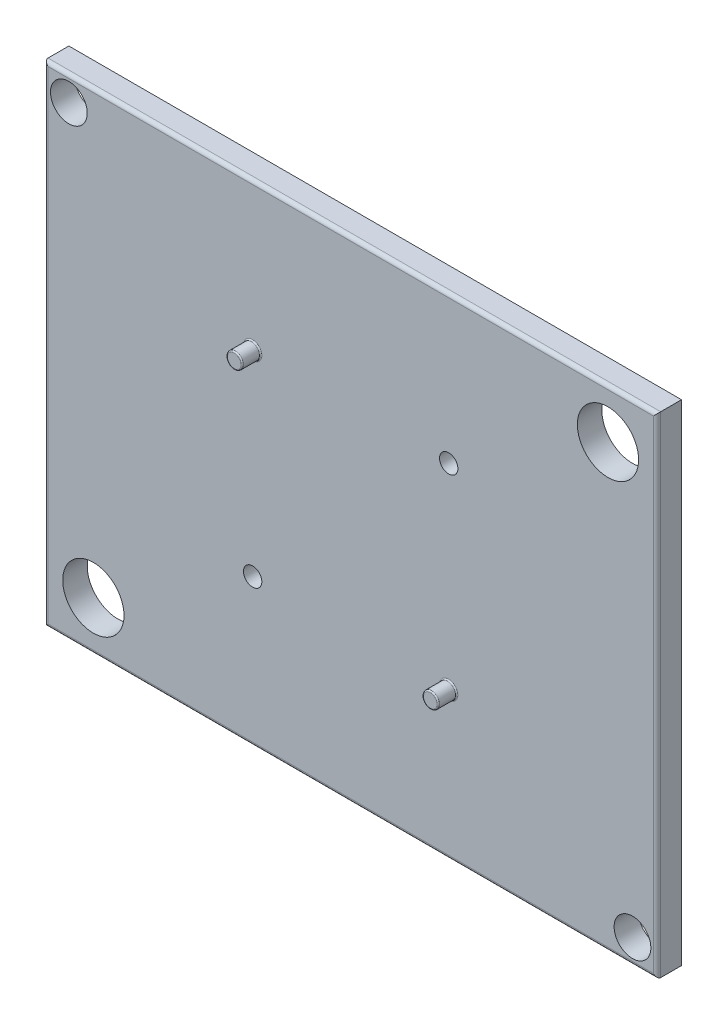
ISO-10303-21;
HEADER;
FILE_DESCRIPTION(('STEP AP214'),'2;1');
FILE_NAME('part.step','',(''),(''),'','','');
FILE_SCHEMA(('AUTOMOTIVE_DESIGN { 1 0 10303 214 1 1 1 1 }'));
ENDSEC;
DATA;
#1=APPLICATION_CONTEXT('core data for automotive mechanical design processes');
#2=APPLICATION_PROTOCOL_DEFINITION('international standard','automotive_design',2000,#1);
#3=PRODUCT_CONTEXT('',#1,'mechanical');
#4=PRODUCT('Part','Part','',(#3));
#5=PRODUCT_RELATED_PRODUCT_CATEGORY('part','',(#4));
#6=PRODUCT_DEFINITION_FORMATION('','',#4);
#7=PRODUCT_DEFINITION_CONTEXT('part definition',#1,'design');
#8=PRODUCT_DEFINITION('design','',#6,#7);
#9=PRODUCT_DEFINITION_SHAPE('','',#8);
#10=(LENGTH_UNIT() NAMED_UNIT(*) SI_UNIT(.MILLI.,.METRE.));
#11=(NAMED_UNIT(*) PLANE_ANGLE_UNIT() SI_UNIT($,.RADIAN.));
#12=(NAMED_UNIT(*) SI_UNIT($,.STERADIAN.) SOLID_ANGLE_UNIT());
#13=UNCERTAINTY_MEASURE_WITH_UNIT(LENGTH_MEASURE(1.E-05),#10,'distance_accuracy_value','');
#14=(GEOMETRIC_REPRESENTATION_CONTEXT(3) GLOBAL_UNCERTAINTY_ASSIGNED_CONTEXT((#13)) GLOBAL_UNIT_ASSIGNED_CONTEXT((#10,
#11,#12)) REPRESENTATION_CONTEXT('',''));
#15=CARTESIAN_POINT('',(0.,0.,0.));
#16=DIRECTION('',(0.,0.,1.));
#17=DIRECTION('',(1.,0.,0.));
#18=AXIS2_PLACEMENT_3D('',#15,#16,#17);
#19=CARTESIAN_POINT('',(0.,0.,2.));
#20=DIRECTION('',(0.,0.,1.));
#21=DIRECTION('',(1.,0.,0.));
#22=AXIS2_PLACEMENT_3D('',#19,#20,#21);
#23=PLANE('',#22);
#24=CARTESIAN_POINT('',(-8.,8.,2.));
#25=DIRECTION('',(0.,0.,1.));
#26=DIRECTION('',(1.,0.,0.));
#27=AXIS2_PLACEMENT_3D('',#24,#25,#26);
#28=CIRCLE('',#27,0.749999999999999);
#29=CARTESIAN_POINT('',(-7.25,8.,2.));
#30=VERTEX_POINT('',#29);
#31=EDGE_CURVE('E156',#30,#30,#28,.F.);
#32=ORIENTED_EDGE('',*,*,#31,.T.);
#33=EDGE_LOOP('',(#32));
#34=FACE_BOUND('',#33,.T.);
#35=CARTESIAN_POINT('',(8.,-8.,2.));
#36=DIRECTION('',(0.,0.,1.));
#37=DIRECTION('',(1.,0.,0.));
#38=AXIS2_PLACEMENT_3D('',#35,#36,#37);
#39=CIRCLE('',#38,0.749999999999999);
#40=CARTESIAN_POINT('',(8.75,-8.,2.));
#41=VERTEX_POINT('',#40);
#42=EDGE_CURVE('E142',#41,#41,#39,.F.);
#43=ORIENTED_EDGE('',*,*,#42,.T.);
#44=EDGE_LOOP('',(#43));
#45=FACE_BOUND('',#44,.T.);
#46=DIRECTION('',(0.,-1.,0.));
#47=VECTOR('',#46,1.);
#48=CARTESIAN_POINT('',(-24.7,-20.,2.));
#49=LINE('',#48,#47);
#50=CARTESIAN_POINT('',(-24.7,19.7,2.));
#51=VERTEX_POINT('',#50);
#52=CARTESIAN_POINT('',(-24.7,-19.7,2.));
#53=VERTEX_POINT('',#52);
#54=EDGE_CURVE('E97',#51,#53,#49,.T.);
#55=ORIENTED_EDGE('',*,*,#54,.T.);
#56=DIRECTION('',(1.,0.,0.));
#57=VECTOR('',#56,1.);
#58=CARTESIAN_POINT('',(25.,-19.7,2.));
#59=LINE('',#58,#57);
#60=CARTESIAN_POINT('',(24.7,-19.7,2.));
#61=VERTEX_POINT('',#60);
#62=EDGE_CURVE('E132',#53,#61,#59,.T.);
#63=ORIENTED_EDGE('',*,*,#62,.T.);
#64=DIRECTION('',(0.,1.,0.));
#65=VECTOR('',#64,1.);
#66=CARTESIAN_POINT('',(24.7,20.,2.));
#67=LINE('',#66,#65);
#68=CARTESIAN_POINT('',(24.7,19.7,2.));
#69=VERTEX_POINT('',#68);
#70=EDGE_CURVE('E130',#61,#69,#67,.T.);
#71=ORIENTED_EDGE('',*,*,#70,.T.);
#72=DIRECTION('',(-1.,0.,0.));
#73=VECTOR('',#72,1.);
#74=CARTESIAN_POINT('',(-25.,19.7,2.));
#75=LINE('',#74,#73);
#76=EDGE_CURVE('E128',#69,#51,#75,.T.);
#77=ORIENTED_EDGE('',*,*,#76,.T.);
#78=EDGE_LOOP('',(#55,#63,#71,#77));
#79=FACE_BOUND('',#78,.T.);
#80=CARTESIAN_POINT('',(-21.,-16.,2.));
#81=DIRECTION('',(0.,0.,1.));
#82=DIRECTION('',(1.,0.,0.));
#83=AXIS2_PLACEMENT_3D('',#80,#81,#82);
#84=CIRCLE('',#83,2.5);
#85=CARTESIAN_POINT('',(-18.5,-16.,2.));
#86=VERTEX_POINT('',#85);
#87=EDGE_CURVE('E192',#86,#86,#84,.T.);
#88=ORIENTED_EDGE('',*,*,#87,.F.);
#89=EDGE_LOOP('',(#88));
#90=FACE_BOUND('',#89,.T.);
#91=CARTESIAN_POINT('',(8.,8.,2.));
#92=DIRECTION('',(0.,0.,1.));
#93=DIRECTION('',(1.,0.,0.));
#94=AXIS2_PLACEMENT_3D('',#91,#92,#93);
#95=CIRCLE('',#94,0.75);
#96=CARTESIAN_POINT('',(8.75,8.,2.));
#97=VERTEX_POINT('',#96);
#98=EDGE_CURVE('E196',#97,#97,#95,.T.);
#99=ORIENTED_EDGE('',*,*,#98,.F.);
#100=EDGE_LOOP('',(#99));
#101=FACE_BOUND('',#100,.T.);
#102=CARTESIAN_POINT('',(-23.,18.,2.));
#103=DIRECTION('',(0.,0.,1.));
#104=DIRECTION('',(1.,0.,0.));
#105=AXIS2_PLACEMENT_3D('',#102,#103,#104);
#106=CIRCLE('',#105,1.5);
#107=CARTESIAN_POINT('',(-21.5,18.,2.));
#108=VERTEX_POINT('',#107);
#109=EDGE_CURVE('E113',#108,#108,#106,.T.);
#110=ORIENTED_EDGE('',*,*,#109,.F.);
#111=EDGE_LOOP('',(#110));
#112=FACE_BOUND('',#111,.T.);
#113=CARTESIAN_POINT('',(23.,-18.,2.));
#114=DIRECTION('',(0.,0.,1.));
#115=DIRECTION('',(1.,0.,0.));
#116=AXIS2_PLACEMENT_3D('',#113,#114,#115);
#117=CIRCLE('',#116,1.5);
#118=CARTESIAN_POINT('',(24.5,-18.,2.));
#119=VERTEX_POINT('',#118);
#120=EDGE_CURVE('E202',#119,#119,#117,.T.);
#121=ORIENTED_EDGE('',*,*,#120,.F.);
#122=EDGE_LOOP('',(#121));
#123=FACE_BOUND('',#122,.T.);
#124=CARTESIAN_POINT('',(-8.,-8.,2.));
#125=DIRECTION('',(0.,0.,1.));
#126=DIRECTION('',(1.,0.,0.));
#127=AXIS2_PLACEMENT_3D('',#124,#125,#126);
#128=CIRCLE('',#127,0.75);
#129=CARTESIAN_POINT('',(-7.25,-8.,2.));
#130=VERTEX_POINT('',#129);
#131=EDGE_CURVE('E206',#130,#130,#128,.T.);
#132=ORIENTED_EDGE('',*,*,#131,.F.);
#133=EDGE_LOOP('',(#132));
#134=FACE_BOUND('',#133,.T.);
#135=CARTESIAN_POINT('',(21.,16.,2.));
#136=DIRECTION('',(0.,0.,1.));
#137=DIRECTION('',(1.,0.,0.));
#138=AXIS2_PLACEMENT_3D('',#135,#136,#137);
#139=CIRCLE('',#138,2.5);
#140=CARTESIAN_POINT('',(23.5,16.,2.));
#141=VERTEX_POINT('',#140);
#142=EDGE_CURVE('E209',#141,#141,#139,.T.);
#143=ORIENTED_EDGE('',*,*,#142,.F.);
#144=EDGE_LOOP('',(#143));
#145=FACE_BOUND('',#144,.T.);
#146=ADVANCED_FACE('F37',(#34,#45,#79,#90,#101,#112,#123,#134,#145),#23,.T.);
#147=CARTESIAN_POINT('',(0.,0.,0.));
#148=DIRECTION('',(0.,0.,1.));
#149=DIRECTION('',(1.,0.,0.));
#150=AXIS2_PLACEMENT_3D('',#147,#148,#149);
#151=PLANE('',#150);
#152=DIRECTION('',(0.,1.,0.));
#153=VECTOR('',#152,1.);
#154=CARTESIAN_POINT('',(25.,20.,0.));
#155=LINE('',#154,#153);
#156=CARTESIAN_POINT('',(25.,-20.,0.));
#157=VERTEX_POINT('',#156);
#158=CARTESIAN_POINT('',(25.,20.,0.));
#159=VERTEX_POINT('',#158);
#160=EDGE_CURVE('E105',#157,#159,#155,.T.);
#161=ORIENTED_EDGE('',*,*,#160,.F.);
#162=DIRECTION('',(1.,0.,0.));
#163=VECTOR('',#162,1.);
#164=CARTESIAN_POINT('',(-25.,-20.,0.));
#165=LINE('',#164,#163);
#166=CARTESIAN_POINT('',(-25.,-20.,0.));
#167=VERTEX_POINT('',#166);
#168=EDGE_CURVE('E121',#167,#157,#165,.T.);
#169=ORIENTED_EDGE('',*,*,#168,.F.);
#170=DIRECTION('',(0.,-1.,0.));
#171=VECTOR('',#170,1.);
#172=CARTESIAN_POINT('',(-25.,20.,0.));
#173=LINE('',#172,#171);
#174=CARTESIAN_POINT('',(-25.,20.,0.));
#175=VERTEX_POINT('',#174);
#176=EDGE_CURVE('E107',#175,#167,#173,.T.);
#177=ORIENTED_EDGE('',*,*,#176,.F.);
#178=DIRECTION('',(-1.,0.,0.));
#179=VECTOR('',#178,1.);
#180=CARTESIAN_POINT('',(-25.,20.,0.));
#181=LINE('',#180,#179);
#182=EDGE_CURVE('E92',#159,#175,#181,.T.);
#183=ORIENTED_EDGE('',*,*,#182,.F.);
#184=EDGE_LOOP('',(#161,#169,#177,#183));
#185=FACE_BOUND('',#184,.T.);
#186=CARTESIAN_POINT('',(-23.,18.,0.));
#187=DIRECTION('',(0.,0.,1.));
#188=DIRECTION('',(1.,0.,0.));
#189=AXIS2_PLACEMENT_3D('',#186,#187,#188);
#190=CIRCLE('',#189,1.5);
#191=CARTESIAN_POINT('',(-21.5,18.,0.));
#192=VERTEX_POINT('',#191);
#193=EDGE_CURVE('E116',#192,#192,#190,.T.);
#194=ORIENTED_EDGE('',*,*,#193,.T.);
#195=EDGE_LOOP('',(#194));
#196=FACE_BOUND('',#195,.T.);
#197=CARTESIAN_POINT('',(23.,-18.,0.));
#198=DIRECTION('',(0.,0.,1.));
#199=DIRECTION('',(1.,0.,0.));
#200=AXIS2_PLACEMENT_3D('',#197,#198,#199);
#201=CIRCLE('',#200,1.5);
#202=CARTESIAN_POINT('',(24.5,-18.,0.));
#203=VERTEX_POINT('',#202);
#204=EDGE_CURVE('E226',#203,#203,#201,.T.);
#205=ORIENTED_EDGE('',*,*,#204,.T.);
#206=EDGE_LOOP('',(#205));
#207=FACE_BOUND('',#206,.T.);
#208=CARTESIAN_POINT('',(8.,8.,0.));
#209=DIRECTION('',(0.,0.,1.));
#210=DIRECTION('',(1.,0.,0.));
#211=AXIS2_PLACEMENT_3D('',#208,#209,#210);
#212=CIRCLE('',#211,0.75);
#213=CARTESIAN_POINT('',(8.75,8.,0.));
#214=VERTEX_POINT('',#213);
#215=EDGE_CURVE('E221',#214,#214,#212,.T.);
#216=ORIENTED_EDGE('',*,*,#215,.T.);
#217=EDGE_LOOP('',(#216));
#218=FACE_BOUND('',#217,.T.);
#219=CARTESIAN_POINT('',(-8.,-8.,0.));
#220=DIRECTION('',(0.,0.,1.));
#221=DIRECTION('',(1.,0.,0.));
#222=AXIS2_PLACEMENT_3D('',#219,#220,#221);
#223=CIRCLE('',#222,0.75);
#224=CARTESIAN_POINT('',(-7.25,-8.,0.));
#225=VERTEX_POINT('',#224);
#226=EDGE_CURVE('E218',#225,#225,#223,.T.);
#227=ORIENTED_EDGE('',*,*,#226,.T.);
#228=EDGE_LOOP('',(#227));
#229=FACE_BOUND('',#228,.T.);
#230=CARTESIAN_POINT('',(-21.,-16.,0.));
#231=DIRECTION('',(0.,0.,1.));
#232=DIRECTION('',(1.,0.,0.));
#233=AXIS2_PLACEMENT_3D('',#230,#231,#232);
#234=CIRCLE('',#233,2.5);
#235=CARTESIAN_POINT('',(-18.5,-16.,0.));
#236=VERTEX_POINT('',#235);
#237=EDGE_CURVE('E211',#236,#236,#234,.T.);
#238=ORIENTED_EDGE('',*,*,#237,.T.);
#239=EDGE_LOOP('',(#238));
#240=FACE_BOUND('',#239,.T.);
#241=CARTESIAN_POINT('',(21.,16.,0.));
#242=DIRECTION('',(0.,0.,1.));
#243=DIRECTION('',(1.,0.,0.));
#244=AXIS2_PLACEMENT_3D('',#241,#242,#243);
#245=CIRCLE('',#244,2.5);
#246=CARTESIAN_POINT('',(23.5,16.,0.));
#247=VERTEX_POINT('',#246);
#248=EDGE_CURVE('E153',#247,#247,#245,.T.);
#249=ORIENTED_EDGE('',*,*,#248,.T.);
#250=EDGE_LOOP('',(#249));
#251=FACE_BOUND('',#250,.T.);
#252=ADVANCED_FACE('F102',(#185,#196,#207,#218,#229,#240,#251),#151,.F.);
#253=CARTESIAN_POINT('',(25.,20.,2.));
#254=DIRECTION('',(-1.,0.,0.));
#255=DIRECTION('',(0.,-1.,0.));
#256=AXIS2_PLACEMENT_3D('',#253,#254,#255);
#257=PLANE('',#256);
#258=DIRECTION('',(0.,0.,-1.));
#259=VECTOR('',#258,1.);
#260=CARTESIAN_POINT('',(25.,20.,2.));
#261=LINE('',#260,#259);
#262=CARTESIAN_POINT('',(25.,20.,1.7));
#263=VERTEX_POINT('',#262);
#264=EDGE_CURVE('E89',#263,#159,#261,.T.);
#265=ORIENTED_EDGE('',*,*,#264,.F.);
#266=DIRECTION('',(0.,1.,0.));
#267=VECTOR('',#266,1.);
#268=CARTESIAN_POINT('',(25.,-20.,1.7));
#269=LINE('',#268,#267);
#270=CARTESIAN_POINT('',(25.,-20.,1.7));
#271=VERTEX_POINT('',#270);
#272=EDGE_CURVE('E138',#263,#271,#269,.F.);
#273=ORIENTED_EDGE('',*,*,#272,.T.);
#274=DIRECTION('',(0.,0.,-1.));
#275=VECTOR('',#274,1.);
#276=CARTESIAN_POINT('',(25.,-20.,2.));
#277=LINE('',#276,#275);
#278=EDGE_CURVE('E111',#271,#157,#277,.T.);
#279=ORIENTED_EDGE('',*,*,#278,.T.);
#280=ORIENTED_EDGE('',*,*,#160,.T.);
#281=EDGE_LOOP('',(#265,#273,#279,#280));
#282=FACE_BOUND('',#281,.T.);
#283=ADVANCED_FACE('F109',(#282),#257,.F.);
#284=CARTESIAN_POINT('',(-25.,20.,2.));
#285=DIRECTION('',(0.,-1.,0.));
#286=DIRECTION('',(0.,0.,-1.));
#287=AXIS2_PLACEMENT_3D('',#284,#285,#286);
#288=PLANE('',#287);
#289=DIRECTION('',(0.,0.,-1.));
#290=VECTOR('',#289,1.);
#291=CARTESIAN_POINT('',(-25.,20.,2.));
#292=LINE('',#291,#290);
#293=CARTESIAN_POINT('',(-25.,20.,1.7));
#294=VERTEX_POINT('',#293);
#295=EDGE_CURVE('E98',#294,#175,#292,.T.);
#296=ORIENTED_EDGE('',*,*,#295,.F.);
#297=DIRECTION('',(-1.,0.,0.));
#298=VECTOR('',#297,1.);
#299=CARTESIAN_POINT('',(25.,20.,1.7));
#300=LINE('',#299,#298);
#301=EDGE_CURVE('E59',#294,#263,#300,.F.);
#302=ORIENTED_EDGE('',*,*,#301,.T.);
#303=ORIENTED_EDGE('',*,*,#264,.T.);
#304=ORIENTED_EDGE('',*,*,#182,.T.);
#305=EDGE_LOOP('',(#296,#302,#303,#304));
#306=FACE_BOUND('',#305,.T.);
#307=ADVANCED_FACE('F91',(#306),#288,.F.);
#308=CARTESIAN_POINT('',(-25.,20.,2.));
#309=DIRECTION('',(1.,0.,0.));
#310=DIRECTION('',(0.,1.,0.));
#311=AXIS2_PLACEMENT_3D('',#308,#309,#310);
#312=PLANE('',#311);
#313=DIRECTION('',(0.,0.,-1.));
#314=VECTOR('',#313,1.);
#315=CARTESIAN_POINT('',(-25.,-20.,2.));
#316=LINE('',#315,#314);
#317=CARTESIAN_POINT('',(-25.,-20.,1.7));
#318=VERTEX_POINT('',#317);
#319=EDGE_CURVE('E124',#318,#167,#316,.T.);
#320=ORIENTED_EDGE('',*,*,#319,.F.);
#321=DIRECTION('',(0.,-1.,0.));
#322=VECTOR('',#321,1.);
#323=CARTESIAN_POINT('',(-25.,20.,1.7));
#324=LINE('',#323,#322);
#325=EDGE_CURVE('E52',#318,#294,#324,.F.);
#326=ORIENTED_EDGE('',*,*,#325,.T.);
#327=ORIENTED_EDGE('',*,*,#295,.T.);
#328=ORIENTED_EDGE('',*,*,#176,.T.);
#329=EDGE_LOOP('',(#320,#326,#327,#328));
#330=FACE_BOUND('',#329,.T.);
#331=ADVANCED_FACE('F257',(#330),#312,.F.);
#332=CARTESIAN_POINT('',(-25.,-20.,2.));
#333=DIRECTION('',(0.,1.,0.));
#334=DIRECTION('',(0.,0.,1.));
#335=AXIS2_PLACEMENT_3D('',#332,#333,#334);
#336=PLANE('',#335);
#337=ORIENTED_EDGE('',*,*,#278,.F.);
#338=DIRECTION('',(1.,0.,0.));
#339=VECTOR('',#338,1.);
#340=CARTESIAN_POINT('',(-25.,-20.,1.7));
#341=LINE('',#340,#339);
#342=EDGE_CURVE('E135',#271,#318,#341,.F.);
#343=ORIENTED_EDGE('',*,*,#342,.T.);
#344=ORIENTED_EDGE('',*,*,#319,.T.);
#345=ORIENTED_EDGE('',*,*,#168,.T.);
#346=EDGE_LOOP('',(#337,#343,#344,#345));
#347=FACE_BOUND('',#346,.T.);
#348=ADVANCED_FACE('F248',(#347),#336,.F.);
#349=CARTESIAN_POINT('',(-23.,18.,2.));
#350=DIRECTION('',(0.,0.,-1.));
#351=DIRECTION('',(-1.,0.,0.));
#352=AXIS2_PLACEMENT_3D('',#349,#350,#351);
#353=CYLINDRICAL_SURFACE('',#352,1.5);
#354=ORIENTED_EDGE('',*,*,#109,.T.);
#355=EDGE_LOOP('',(#354));
#356=FACE_BOUND('',#355,.T.);
#357=ORIENTED_EDGE('',*,*,#193,.F.);
#358=EDGE_LOOP('',(#357));
#359=FACE_BOUND('',#358,.T.);
#360=ADVANCED_FACE('F238',(#356,#359),#353,.F.);
#361=CARTESIAN_POINT('',(23.,-18.,2.));
#362=DIRECTION('',(0.,0.,-1.));
#363=DIRECTION('',(-1.,0.,0.));
#364=AXIS2_PLACEMENT_3D('',#361,#362,#363);
#365=CYLINDRICAL_SURFACE('',#364,1.5);
#366=ORIENTED_EDGE('',*,*,#120,.T.);
#367=EDGE_LOOP('',(#366));
#368=FACE_BOUND('',#367,.T.);
#369=ORIENTED_EDGE('',*,*,#204,.F.);
#370=EDGE_LOOP('',(#369));
#371=FACE_BOUND('',#370,.T.);
#372=ADVANCED_FACE('F235',(#368,#371),#365,.F.);
#373=CARTESIAN_POINT('',(8.,8.,2.));
#374=DIRECTION('',(0.,0.,-1.));
#375=DIRECTION('',(-1.,0.,0.));
#376=AXIS2_PLACEMENT_3D('',#373,#374,#375);
#377=CYLINDRICAL_SURFACE('',#376,0.75);
#378=ORIENTED_EDGE('',*,*,#98,.T.);
#379=EDGE_LOOP('',(#378));
#380=FACE_BOUND('',#379,.T.);
#381=ORIENTED_EDGE('',*,*,#215,.F.);
#382=EDGE_LOOP('',(#381));
#383=FACE_BOUND('',#382,.T.);
#384=ADVANCED_FACE('F237',(#380,#383),#377,.F.);
#385=CARTESIAN_POINT('',(-8.,-8.,2.));
#386=DIRECTION('',(0.,0.,-1.));
#387=DIRECTION('',(-1.,0.,0.));
#388=AXIS2_PLACEMENT_3D('',#385,#386,#387);
#389=CYLINDRICAL_SURFACE('',#388,0.75);
#390=ORIENTED_EDGE('',*,*,#131,.T.);
#391=EDGE_LOOP('',(#390));
#392=FACE_BOUND('',#391,.T.);
#393=ORIENTED_EDGE('',*,*,#226,.F.);
#394=EDGE_LOOP('',(#393));
#395=FACE_BOUND('',#394,.T.);
#396=ADVANCED_FACE('F245',(#392,#395),#389,.F.);
#397=CARTESIAN_POINT('',(-21.,-16.,2.));
#398=DIRECTION('',(0.,0.,-1.));
#399=DIRECTION('',(-1.,0.,0.));
#400=AXIS2_PLACEMENT_3D('',#397,#398,#399);
#401=CYLINDRICAL_SURFACE('',#400,2.5);
#402=ORIENTED_EDGE('',*,*,#87,.T.);
#403=EDGE_LOOP('',(#402));
#404=FACE_BOUND('',#403,.T.);
#405=ORIENTED_EDGE('',*,*,#237,.F.);
#406=EDGE_LOOP('',(#405));
#407=FACE_BOUND('',#406,.T.);
#408=ADVANCED_FACE('F310',(#404,#407),#401,.F.);
#409=CARTESIAN_POINT('',(21.,16.,2.));
#410=DIRECTION('',(0.,0.,-1.));
#411=DIRECTION('',(-1.,0.,0.));
#412=AXIS2_PLACEMENT_3D('',#409,#410,#411);
#413=CYLINDRICAL_SURFACE('',#412,2.5);
#414=ORIENTED_EDGE('',*,*,#142,.T.);
#415=EDGE_LOOP('',(#414));
#416=FACE_BOUND('',#415,.T.);
#417=ORIENTED_EDGE('',*,*,#248,.F.);
#418=EDGE_LOOP('',(#417));
#419=FACE_BOUND('',#418,.T.);
#420=ADVANCED_FACE('F281',(#416,#419),#413,.F.);
#421=CARTESIAN_POINT('',(0.,19.7,1.7));
#422=DIRECTION('',(1.,0.,0.));
#423=DIRECTION('',(0.,0.,-1.));
#424=AXIS2_PLACEMENT_3D('',#421,#422,#423);
#425=CYLINDRICAL_SURFACE('',#424,0.3);
#426=CARTESIAN_POINT('',(24.7,19.7,1.7));
#427=DIRECTION('',(0.707106781186547,-0.707106781186547,0.));
#428=DIRECTION('',(0.707106781186547,0.707106781186548,0.));
#429=AXIS2_PLACEMENT_3D('',#426,#427,#428);
#430=ELLIPSE('',#429,0.424264068711928,0.3);
#431=EDGE_CURVE('E147',#263,#69,#430,.T.);
#432=ORIENTED_EDGE('',*,*,#431,.F.);
#433=ORIENTED_EDGE('',*,*,#301,.F.);
#434=CARTESIAN_POINT('',(-24.7,19.7,1.7));
#435=DIRECTION('',(0.707106781186547,0.707106781186548,0.));
#436=DIRECTION('',(-0.707106781186547,0.707106781186547,0.));
#437=AXIS2_PLACEMENT_3D('',#434,#435,#436);
#438=ELLIPSE('',#437,0.424264068711929,0.3);
#439=EDGE_CURVE('E150',#51,#294,#438,.F.);
#440=ORIENTED_EDGE('',*,*,#439,.F.);
#441=ORIENTED_EDGE('',*,*,#76,.F.);
#442=EDGE_LOOP('',(#432,#433,#440,#441));
#443=FACE_BOUND('',#442,.T.);
#444=ADVANCED_FACE('F277',(#443),#425,.T.);
#445=CARTESIAN_POINT('',(-24.7,0.,1.7));
#446=DIRECTION('',(0.,1.,0.));
#447=DIRECTION('',(-1.,0.,0.));
#448=AXIS2_PLACEMENT_3D('',#445,#446,#447);
#449=CYLINDRICAL_SURFACE('',#448,0.3);
#450=ORIENTED_EDGE('',*,*,#439,.T.);
#451=ORIENTED_EDGE('',*,*,#325,.F.);
#452=CARTESIAN_POINT('',(-24.7,-19.7,1.7));
#453=DIRECTION('',(-0.707106781186547,0.707106781186547,0.));
#454=DIRECTION('',(0.707106781186547,0.707106781186548,0.));
#455=AXIS2_PLACEMENT_3D('',#452,#453,#454);
#456=ELLIPSE('',#455,0.424264068711928,0.3);
#457=EDGE_CURVE('E145',#53,#318,#456,.F.);
#458=ORIENTED_EDGE('',*,*,#457,.F.);
#459=ORIENTED_EDGE('',*,*,#54,.F.);
#460=EDGE_LOOP('',(#450,#451,#458,#459));
#461=FACE_BOUND('',#460,.T.);
#462=ADVANCED_FACE('F273',(#461),#449,.T.);
#463=CARTESIAN_POINT('',(24.7,0.,1.7));
#464=DIRECTION('',(0.,-1.,0.));
#465=DIRECTION('',(1.,0.,0.));
#466=AXIS2_PLACEMENT_3D('',#463,#464,#465);
#467=CYLINDRICAL_SURFACE('',#466,0.3);
#468=ORIENTED_EDGE('',*,*,#431,.T.);
#469=ORIENTED_EDGE('',*,*,#70,.F.);
#470=CARTESIAN_POINT('',(24.7,-19.7,1.7));
#471=DIRECTION('',(-0.707106781186547,-0.707106781186548,0.));
#472=DIRECTION('',(0.707106781186547,-0.707106781186547,0.));
#473=AXIS2_PLACEMENT_3D('',#470,#471,#472);
#474=ELLIPSE('',#473,0.424264068711929,0.3);
#475=EDGE_CURVE('E143',#271,#61,#474,.T.);
#476=ORIENTED_EDGE('',*,*,#475,.F.);
#477=ORIENTED_EDGE('',*,*,#272,.F.);
#478=EDGE_LOOP('',(#468,#469,#476,#477));
#479=FACE_BOUND('',#478,.T.);
#480=ADVANCED_FACE('F269',(#479),#467,.T.);
#481=CARTESIAN_POINT('',(0.,-19.7,1.7));
#482=DIRECTION('',(-1.,0.,0.));
#483=DIRECTION('',(0.,0.,1.));
#484=AXIS2_PLACEMENT_3D('',#481,#482,#483);
#485=CYLINDRICAL_SURFACE('',#484,0.3);
#486=ORIENTED_EDGE('',*,*,#457,.T.);
#487=ORIENTED_EDGE('',*,*,#342,.F.);
#488=ORIENTED_EDGE('',*,*,#475,.T.);
#489=ORIENTED_EDGE('',*,*,#62,.F.);
#490=EDGE_LOOP('',(#486,#487,#488,#489));
#491=FACE_BOUND('',#490,.T.);
#492=ADVANCED_FACE('F265',(#491),#485,.T.);
#493=CARTESIAN_POINT('',(-8.,8.,3.5));
#494=DIRECTION('',(0.,0.,-1.));
#495=DIRECTION('',(-1.,0.,0.));
#496=AXIS2_PLACEMENT_3D('',#493,#494,#495);
#497=CYLINDRICAL_SURFACE('',#496,0.649999999999999);
#498=CARTESIAN_POINT('',(-8.,8.,2.1));
#499=DIRECTION('',(0.,0.,1.));
#500=DIRECTION('',(1.,0.,0.));
#501=AXIS2_PLACEMENT_3D('',#498,#499,#500);
#502=CIRCLE('',#501,0.649999999999999);
#503=CARTESIAN_POINT('',(-7.35,8.,2.1));
#504=VERTEX_POINT('',#503);
#505=EDGE_CURVE('E162',#504,#504,#502,.T.);
#506=ORIENTED_EDGE('',*,*,#505,.T.);
#507=EDGE_LOOP('',(#506));
#508=FACE_BOUND('',#507,.T.);
#509=CARTESIAN_POINT('',(-8.,8.,3.4));
#510=DIRECTION('',(0.,0.,1.));
#511=DIRECTION('',(1.,0.,0.));
#512=AXIS2_PLACEMENT_3D('',#509,#510,#511);
#513=CIRCLE('',#512,0.649999999999999);
#514=CARTESIAN_POINT('',(-7.35,8.,3.4));
#515=VERTEX_POINT('',#514);
#516=EDGE_CURVE('E159',#515,#515,#513,.F.);
#517=ORIENTED_EDGE('',*,*,#516,.T.);
#518=EDGE_LOOP('',(#517));
#519=FACE_BOUND('',#518,.T.);
#520=ADVANCED_FACE('F268',(#508,#519),#497,.T.);
#521=CARTESIAN_POINT('',(-8.,8.,3.5));
#522=DIRECTION('',(0.,0.,1.));
#523=DIRECTION('',(1.,0.,0.));
#524=AXIS2_PLACEMENT_3D('',#521,#522,#523);
#525=PLANE('',#524);
#526=CARTESIAN_POINT('',(-8.,8.,3.5));
#527=DIRECTION('',(0.,0.,1.));
#528=DIRECTION('',(1.,0.,0.));
#529=AXIS2_PLACEMENT_3D('',#526,#527,#528);
#530=CIRCLE('',#529,0.549999999999999);
#531=CARTESIAN_POINT('',(-7.45,8.,3.5));
#532=VERTEX_POINT('',#531);
#533=EDGE_CURVE('E165',#532,#532,#530,.T.);
#534=ORIENTED_EDGE('',*,*,#533,.T.);
#535=EDGE_LOOP('',(#534));
#536=FACE_BOUND('',#535,.T.);
#537=ADVANCED_FACE('F296',(#536),#525,.T.);
#538=CARTESIAN_POINT('',(8.,-8.,3.5));
#539=DIRECTION('',(0.,0.,-1.));
#540=DIRECTION('',(-1.,0.,0.));
#541=AXIS2_PLACEMENT_3D('',#538,#539,#540);
#542=CYLINDRICAL_SURFACE('',#541,0.649999999999999);
#543=CARTESIAN_POINT('',(8.,-8.,2.1));
#544=DIRECTION('',(0.,0.,1.));
#545=DIRECTION('',(1.,0.,0.));
#546=AXIS2_PLACEMENT_3D('',#543,#544,#545);
#547=CIRCLE('',#546,0.649999999999999);
#548=CARTESIAN_POINT('',(8.65,-8.,2.1));
#549=VERTEX_POINT('',#548);
#550=EDGE_CURVE('E45',#549,#549,#547,.T.);
#551=ORIENTED_EDGE('',*,*,#550,.T.);
#552=EDGE_LOOP('',(#551));
#553=FACE_BOUND('',#552,.T.);
#554=CARTESIAN_POINT('',(8.,-8.,3.4));
#555=DIRECTION('',(0.,0.,1.));
#556=DIRECTION('',(1.,0.,0.));
#557=AXIS2_PLACEMENT_3D('',#554,#555,#556);
#558=CIRCLE('',#557,0.649999999999999);
#559=CARTESIAN_POINT('',(8.65,-8.,3.4));
#560=VERTEX_POINT('',#559);
#561=EDGE_CURVE('E168',#560,#560,#558,.F.);
#562=ORIENTED_EDGE('',*,*,#561,.T.);
#563=EDGE_LOOP('',(#562));
#564=FACE_BOUND('',#563,.T.);
#565=ADVANCED_FACE('F173',(#553,#564),#542,.T.);
#566=CARTESIAN_POINT('',(8.,-8.,3.5));
#567=DIRECTION('',(0.,0.,1.));
#568=DIRECTION('',(1.,0.,0.));
#569=AXIS2_PLACEMENT_3D('',#566,#567,#568);
#570=PLANE('',#569);
#571=CARTESIAN_POINT('',(8.,-8.,3.5));
#572=DIRECTION('',(0.,0.,1.));
#573=DIRECTION('',(1.,0.,0.));
#574=AXIS2_PLACEMENT_3D('',#571,#572,#573);
#575=CIRCLE('',#574,0.549999999999999);
#576=CARTESIAN_POINT('',(8.55,-8.,3.5));
#577=VERTEX_POINT('',#576);
#578=EDGE_CURVE('E11',#577,#577,#575,.T.);
#579=ORIENTED_EDGE('',*,*,#578,.T.);
#580=EDGE_LOOP('',(#579));
#581=FACE_BOUND('',#580,.T.);
#582=ADVANCED_FACE('F286',(#581),#570,.T.);
#583=CARTESIAN_POINT('',(-8.,8.,2.1));
#584=DIRECTION('',(0.,0.,1.));
#585=DIRECTION('',(1.,0.,0.));
#586=AXIS2_PLACEMENT_3D('',#583,#584,#585);
#587=TOROIDAL_SURFACE('',#586,0.749999999999999,0.1);
#588=ORIENTED_EDGE('',*,*,#505,.F.);
#589=EDGE_LOOP('',(#588));
#590=FACE_BOUND('',#589,.T.);
#591=ORIENTED_EDGE('',*,*,#31,.F.);
#592=EDGE_LOOP('',(#591));
#593=FACE_BOUND('',#592,.T.);
#594=ADVANCED_FACE('F283',(#590,#593),#587,.F.);
#595=CARTESIAN_POINT('',(-8.,8.,3.4));
#596=DIRECTION('',(0.,0.,1.));
#597=DIRECTION('',(1.,0.,0.));
#598=AXIS2_PLACEMENT_3D('',#595,#596,#597);
#599=TOROIDAL_SURFACE('',#598,0.549999999999999,0.1);
#600=ORIENTED_EDGE('',*,*,#516,.F.);
#601=EDGE_LOOP('',(#600));
#602=FACE_BOUND('',#601,.T.);
#603=ORIENTED_EDGE('',*,*,#533,.F.);
#604=EDGE_LOOP('',(#603));
#605=FACE_BOUND('',#604,.T.);
#606=ADVANCED_FACE('F179',(#602,#605),#599,.T.);
#607=CARTESIAN_POINT('',(8.,-8.,2.1));
#608=DIRECTION('',(0.,0.,1.));
#609=DIRECTION('',(1.,0.,0.));
#610=AXIS2_PLACEMENT_3D('',#607,#608,#609);
#611=TOROIDAL_SURFACE('',#610,0.749999999999999,0.1);
#612=ORIENTED_EDGE('',*,*,#550,.F.);
#613=EDGE_LOOP('',(#612));
#614=FACE_BOUND('',#613,.T.);
#615=ORIENTED_EDGE('',*,*,#42,.F.);
#616=EDGE_LOOP('',(#615));
#617=FACE_BOUND('',#616,.T.);
#618=ADVANCED_FACE('F176',(#614,#617),#611,.F.);
#619=CARTESIAN_POINT('',(8.,-8.,3.4));
#620=DIRECTION('',(0.,0.,1.));
#621=DIRECTION('',(1.,0.,0.));
#622=AXIS2_PLACEMENT_3D('',#619,#620,#621);
#623=TOROIDAL_SURFACE('',#622,0.549999999999999,0.1);
#624=ORIENTED_EDGE('',*,*,#561,.F.);
#625=EDGE_LOOP('',(#624));
#626=FACE_BOUND('',#625,.T.);
#627=ORIENTED_EDGE('',*,*,#578,.F.);
#628=EDGE_LOOP('',(#627));
#629=FACE_BOUND('',#628,.T.);
#630=ADVANCED_FACE('F39',(#626,#629),#623,.T.);
#631=CLOSED_SHELL('',(#146,#252,#283,#307,#331,#348,#360,#372,#384,#396,#408,#420,#444,#462,
#480,#492,#520,#537,#565,#582,#594,#606,#618,#630));
#632=MANIFOLD_SOLID_BREP('B2',#631);
#633=ADVANCED_BREP_SHAPE_REPRESENTATION('',(#18,#632),#14);
#634=SHAPE_DEFINITION_REPRESENTATION(#9,#633);
ENDSEC;
END-ISO-10303-21;
